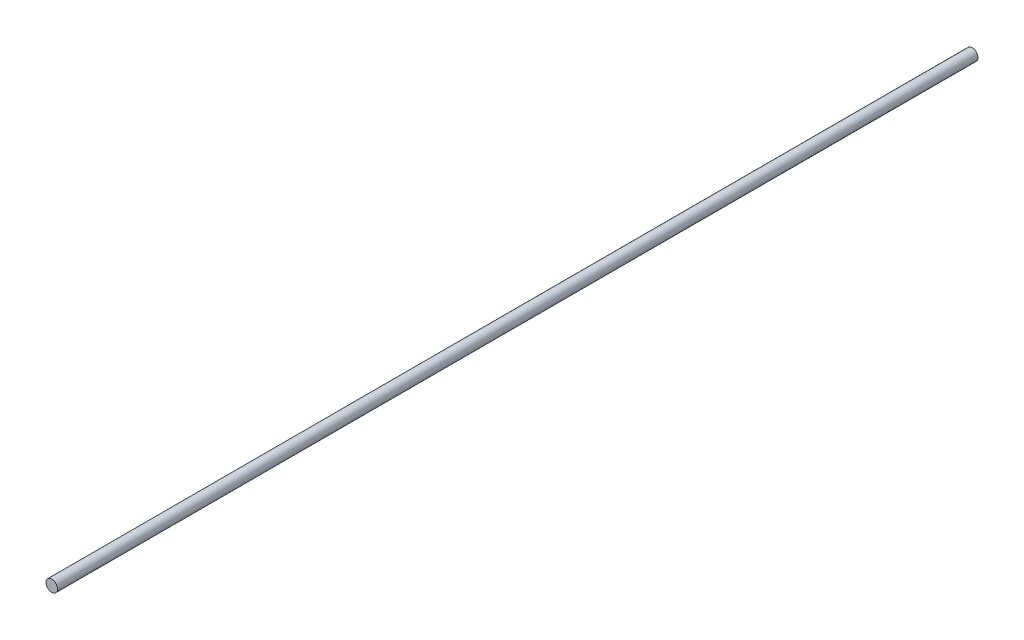
ISO-10303-21;
HEADER;
FILE_DESCRIPTION(('STEP AP214'),'2;1');
FILE_NAME('part.step','',(''),(''),'','','');
FILE_SCHEMA(('AUTOMOTIVE_DESIGN { 1 0 10303 214 1 1 1 1 }'));
ENDSEC;
DATA;
#1=APPLICATION_CONTEXT('core data for automotive mechanical design processes');
#2=APPLICATION_PROTOCOL_DEFINITION('international standard','automotive_design',2000,#1);
#3=PRODUCT_CONTEXT('',#1,'mechanical');
#4=PRODUCT('Part','Part','',(#3));
#5=PRODUCT_RELATED_PRODUCT_CATEGORY('part','',(#4));
#6=PRODUCT_DEFINITION_FORMATION('','',#4);
#7=PRODUCT_DEFINITION_CONTEXT('part definition',#1,'design');
#8=PRODUCT_DEFINITION('design','',#6,#7);
#9=PRODUCT_DEFINITION_SHAPE('','',#8);
#10=(LENGTH_UNIT() NAMED_UNIT(*) SI_UNIT(.MILLI.,.METRE.));
#11=(NAMED_UNIT(*) PLANE_ANGLE_UNIT() SI_UNIT($,.RADIAN.));
#12=(NAMED_UNIT(*) SI_UNIT($,.STERADIAN.) SOLID_ANGLE_UNIT());
#13=UNCERTAINTY_MEASURE_WITH_UNIT(LENGTH_MEASURE(1.E-05),#10,'distance_accuracy_value','');
#14=(GEOMETRIC_REPRESENTATION_CONTEXT(3) GLOBAL_UNCERTAINTY_ASSIGNED_CONTEXT((#13)) GLOBAL_UNIT_ASSIGNED_CONTEXT((#10,
#11,#12)) REPRESENTATION_CONTEXT('',''));
#15=CARTESIAN_POINT('',(0.,0.,0.));
#16=DIRECTION('',(0.,0.,1.));
#17=DIRECTION('',(1.,0.,0.));
#18=AXIS2_PLACEMENT_3D('',#15,#16,#17);
#19=CARTESIAN_POINT('',(0.,0.,400.));
#20=DIRECTION('',(0.,0.,-1.));
#21=DIRECTION('',(-1.,0.,0.));
#22=AXIS2_PLACEMENT_3D('',#19,#20,#21);
#23=CYLINDRICAL_SURFACE('',#22,2.5);
#24=CARTESIAN_POINT('',(0.,0.,400.));
#25=DIRECTION('',(0.,0.,1.));
#26=DIRECTION('',(1.,0.,0.));
#27=AXIS2_PLACEMENT_3D('',#24,#25,#26);
#28=CIRCLE('',#27,2.5);
#29=CARTESIAN_POINT('',(2.5,0.,400.));
#30=VERTEX_POINT('',#29);
#31=EDGE_CURVE('E10',#30,#30,#28,.T.);
#32=ORIENTED_EDGE('',*,*,#31,.F.);
#33=EDGE_LOOP('',(#32));
#34=FACE_BOUND('',#33,.T.);
#35=CARTESIAN_POINT('',(0.,0.,0.));
#36=DIRECTION('',(0.,0.,1.));
#37=DIRECTION('',(1.,0.,0.));
#38=AXIS2_PLACEMENT_3D('',#35,#36,#37);
#39=CIRCLE('',#38,2.5);
#40=CARTESIAN_POINT('',(2.5,0.,0.));
#41=VERTEX_POINT('',#40);
#42=EDGE_CURVE('E40',#41,#41,#39,.T.);
#43=ORIENTED_EDGE('',*,*,#42,.T.);
#44=EDGE_LOOP('',(#43));
#45=FACE_BOUND('',#44,.T.);
#46=ADVANCED_FACE('F37',(#34,#45),#23,.T.);
#47=CARTESIAN_POINT('',(0.,0.,400.));
#48=DIRECTION('',(0.,0.,1.));
#49=DIRECTION('',(1.,0.,0.));
#50=AXIS2_PLACEMENT_3D('',#47,#48,#49);
#51=PLANE('',#50);
#52=ORIENTED_EDGE('',*,*,#31,.T.);
#53=EDGE_LOOP('',(#52));
#54=FACE_BOUND('',#53,.T.);
#55=ADVANCED_FACE('F52',(#54),#51,.T.);
#56=CARTESIAN_POINT('',(0.,0.,0.));
#57=DIRECTION('',(0.,0.,1.));
#58=DIRECTION('',(1.,0.,0.));
#59=AXIS2_PLACEMENT_3D('',#56,#57,#58);
#60=PLANE('',#59);
#61=ORIENTED_EDGE('',*,*,#42,.F.);
#62=EDGE_LOOP('',(#61));
#63=FACE_BOUND('',#62,.T.);
#64=ADVANCED_FACE('F50',(#63),#60,.F.);
#65=CLOSED_SHELL('',(#46,#55,#64));
#66=MANIFOLD_SOLID_BREP('B2',#65);
#67=ADVANCED_BREP_SHAPE_REPRESENTATION('',(#18,#66),#14);
#68=SHAPE_DEFINITION_REPRESENTATION(#9,#67);
ENDSEC;
END-ISO-10303-21;
